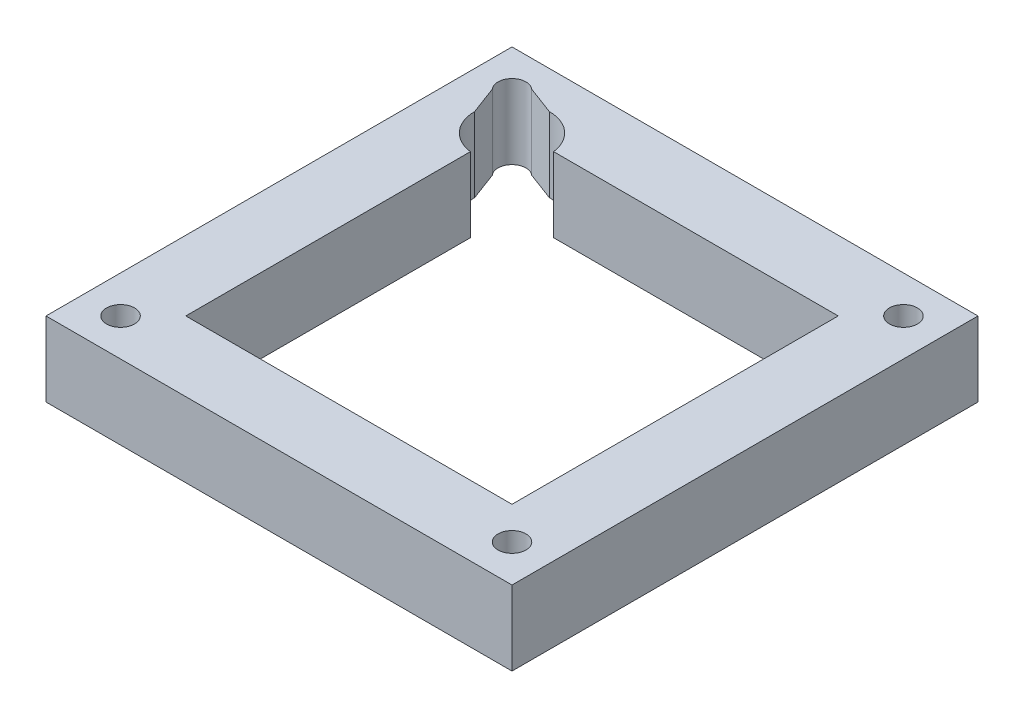
ISO-10303-21;
HEADER;
FILE_DESCRIPTION(('STEP AP214'),'2;1');
FILE_NAME('part.step','',(''),(''),'','','');
FILE_SCHEMA(('AUTOMOTIVE_DESIGN { 1 0 10303 214 1 1 1 1 }'));
ENDSEC;
DATA;
#1=APPLICATION_CONTEXT('core data for automotive mechanical design processes');
#2=APPLICATION_PROTOCOL_DEFINITION('international standard','automotive_design',2000,#1);
#3=PRODUCT_CONTEXT('',#1,'mechanical');
#4=PRODUCT('Part','Part','',(#3));
#5=PRODUCT_RELATED_PRODUCT_CATEGORY('part','',(#4));
#6=PRODUCT_DEFINITION_FORMATION('','',#4);
#7=PRODUCT_DEFINITION_CONTEXT('part definition',#1,'design');
#8=PRODUCT_DEFINITION('design','',#6,#7);
#9=PRODUCT_DEFINITION_SHAPE('','',#8);
#10=(LENGTH_UNIT() NAMED_UNIT(*) SI_UNIT(.MILLI.,.METRE.));
#11=(NAMED_UNIT(*) PLANE_ANGLE_UNIT() SI_UNIT($,.RADIAN.));
#12=(NAMED_UNIT(*) SI_UNIT($,.STERADIAN.) SOLID_ANGLE_UNIT());
#13=UNCERTAINTY_MEASURE_WITH_UNIT(LENGTH_MEASURE(1.E-05),#10,'distance_accuracy_value','');
#14=(GEOMETRIC_REPRESENTATION_CONTEXT(3) GLOBAL_UNCERTAINTY_ASSIGNED_CONTEXT((#13)) GLOBAL_UNIT_ASSIGNED_CONTEXT((#10,
#11,#12)) REPRESENTATION_CONTEXT('',''));
#15=CARTESIAN_POINT('',(0.,0.,0.));
#16=DIRECTION('',(0.,0.,1.));
#17=DIRECTION('',(1.,0.,0.));
#18=AXIS2_PLACEMENT_3D('',#15,#16,#17);
#19=CARTESIAN_POINT('',(0.,8.,25.));
#20=DIRECTION('',(0.,0.,-1.));
#21=DIRECTION('',(-1.,0.,0.));
#22=AXIS2_PLACEMENT_3D('',#19,#20,#21);
#23=PLANE('',#22);
#24=DIRECTION('',(1.,0.,0.));
#25=VECTOR('',#24,1.);
#26=CARTESIAN_POINT('',(0.,0.,25.));
#27=LINE('',#26,#25);
#28=CARTESIAN_POINT('',(-25.,0.,25.));
#29=VERTEX_POINT('',#28);
#30=CARTESIAN_POINT('',(25.,0.,25.));
#31=VERTEX_POINT('',#30);
#32=EDGE_CURVE('E383',#29,#31,#27,.T.);
#33=ORIENTED_EDGE('',*,*,#32,.T.);
#34=DIRECTION('',(0.,-1.,0.));
#35=VECTOR('',#34,1.);
#36=CARTESIAN_POINT('',(25.,8.,25.));
#37=LINE('',#36,#35);
#38=CARTESIAN_POINT('',(25.,8.,25.));
#39=VERTEX_POINT('',#38);
#40=EDGE_CURVE('E11',#39,#31,#37,.T.);
#41=ORIENTED_EDGE('',*,*,#40,.F.);
#42=DIRECTION('',(1.,0.,0.));
#43=VECTOR('',#42,1.);
#44=CARTESIAN_POINT('',(0.,8.,25.));
#45=LINE('',#44,#43);
#46=CARTESIAN_POINT('',(-25.,8.,25.));
#47=VERTEX_POINT('',#46);
#48=EDGE_CURVE('E323',#47,#39,#45,.T.);
#49=ORIENTED_EDGE('',*,*,#48,.F.);
#50=DIRECTION('',(0.,-1.,0.));
#51=VECTOR('',#50,1.);
#52=CARTESIAN_POINT('',(-25.,8.,25.));
#53=LINE('',#52,#51);
#54=EDGE_CURVE('E406',#47,#29,#53,.T.);
#55=ORIENTED_EDGE('',*,*,#54,.T.);
#56=EDGE_LOOP('',(#33,#41,#49,#55));
#57=FACE_BOUND('',#56,.T.);
#58=ADVANCED_FACE('F48',(#57),#23,.F.);
#59=CARTESIAN_POINT('',(25.,8.,0.));
#60=DIRECTION('',(-1.,0.,0.));
#61=DIRECTION('',(0.,0.,1.));
#62=AXIS2_PLACEMENT_3D('',#59,#60,#61);
#63=PLANE('',#62);
#64=DIRECTION('',(0.,0.,-1.));
#65=VECTOR('',#64,1.);
#66=CARTESIAN_POINT('',(25.,0.,0.));
#67=LINE('',#66,#65);
#68=CARTESIAN_POINT('',(25.,0.,-25.));
#69=VERTEX_POINT('',#68);
#70=EDGE_CURVE('E387',#31,#69,#67,.T.);
#71=ORIENTED_EDGE('',*,*,#70,.T.);
#72=DIRECTION('',(0.,-1.,0.));
#73=VECTOR('',#72,1.);
#74=CARTESIAN_POINT('',(25.,8.,-25.));
#75=LINE('',#74,#73);
#76=CARTESIAN_POINT('',(25.,8.,-25.));
#77=VERTEX_POINT('',#76);
#78=EDGE_CURVE('E58',#77,#69,#75,.T.);
#79=ORIENTED_EDGE('',*,*,#78,.F.);
#80=DIRECTION('',(0.,0.,-1.));
#81=VECTOR('',#80,1.);
#82=CARTESIAN_POINT('',(25.,8.,0.));
#83=LINE('',#82,#81);
#84=EDGE_CURVE('E327',#39,#77,#83,.T.);
#85=ORIENTED_EDGE('',*,*,#84,.F.);
#86=ORIENTED_EDGE('',*,*,#40,.T.);
#87=EDGE_LOOP('',(#71,#79,#85,#86));
#88=FACE_BOUND('',#87,.T.);
#89=ADVANCED_FACE('F494',(#88),#63,.F.);
#90=CARTESIAN_POINT('',(0.,8.,-25.));
#91=DIRECTION('',(0.,0.,-1.));
#92=DIRECTION('',(-1.,0.,0.));
#93=AXIS2_PLACEMENT_3D('',#90,#91,#92);
#94=PLANE('',#93);
#95=DIRECTION('',(1.,0.,0.));
#96=VECTOR('',#95,1.);
#97=CARTESIAN_POINT('',(0.,6.5000000000053,-25.));
#98=LINE('',#97,#96);
#99=CARTESIAN_POINT('',(-10.0000000000553,6.5000000000053,-25.));
#100=VERTEX_POINT('',#99);
#101=CARTESIAN_POINT('',(9.9999999999447,6.5000000000053,-25.));
#102=VERTEX_POINT('',#101);
#103=EDGE_CURVE('E74',#100,#102,#98,.T.);
#104=ORIENTED_EDGE('',*,*,#103,.F.);
#105=DIRECTION('',(0.,1.,0.));
#106=VECTOR('',#105,1.);
#107=CARTESIAN_POINT('',(-10.0000000000553,8.,-25.));
#108=LINE('',#107,#106);
#109=CARTESIAN_POINT('',(-10.0000000000553,1.5000000000053,-25.));
#110=VERTEX_POINT('',#109);
#111=EDGE_CURVE('E249',#110,#100,#108,.T.);
#112=ORIENTED_EDGE('',*,*,#111,.F.);
#113=DIRECTION('',(-1.,0.,0.));
#114=VECTOR('',#113,1.);
#115=CARTESIAN_POINT('',(0.,1.5000000000053,-25.));
#116=LINE('',#115,#114);
#117=CARTESIAN_POINT('',(9.9999999999447,1.5000000000053,-25.));
#118=VERTEX_POINT('',#117);
#119=EDGE_CURVE('E268',#118,#110,#116,.T.);
#120=ORIENTED_EDGE('',*,*,#119,.F.);
#121=DIRECTION('',(0.,-1.,0.));
#122=VECTOR('',#121,1.);
#123=CARTESIAN_POINT('',(9.9999999999447,8.,-25.));
#124=LINE('',#123,#122);
#125=EDGE_CURVE('E264',#102,#118,#124,.T.);
#126=ORIENTED_EDGE('',*,*,#125,.F.);
#127=EDGE_LOOP('',(#104,#112,#120,#126));
#128=FACE_BOUND('',#127,.T.);
#129=DIRECTION('',(1.,0.,0.));
#130=VECTOR('',#129,1.);
#131=CARTESIAN_POINT('',(0.,0.,-25.));
#132=LINE('',#131,#130);
#133=CARTESIAN_POINT('',(-25.,0.,-25.));
#134=VERTEX_POINT('',#133);
#135=EDGE_CURVE('E391',#134,#69,#132,.T.);
#136=ORIENTED_EDGE('',*,*,#135,.F.);
#137=DIRECTION('',(0.,-1.,0.));
#138=VECTOR('',#137,1.);
#139=CARTESIAN_POINT('',(-25.,8.,-25.));
#140=LINE('',#139,#138);
#141=CARTESIAN_POINT('',(-25.,8.,-25.));
#142=VERTEX_POINT('',#141);
#143=EDGE_CURVE('E409',#142,#134,#140,.T.);
#144=ORIENTED_EDGE('',*,*,#143,.F.);
#145=DIRECTION('',(1.,0.,0.));
#146=VECTOR('',#145,1.);
#147=CARTESIAN_POINT('',(0.,8.,-25.));
#148=LINE('',#147,#146);
#149=EDGE_CURVE('E330',#142,#77,#148,.T.);
#150=ORIENTED_EDGE('',*,*,#149,.T.);
#151=ORIENTED_EDGE('',*,*,#78,.T.);
#152=EDGE_LOOP('',(#136,#144,#150,#151));
#153=FACE_BOUND('',#152,.T.);
#154=ADVANCED_FACE('F492',(#128,#153),#94,.T.);
#155=CARTESIAN_POINT('',(-17.,8.,-17.));
#156=DIRECTION('',(0.,-1.,0.));
#157=DIRECTION('',(0.,0.,-1.));
#158=AXIS2_PLACEMENT_3D('',#155,#156,#157);
#159=CYLINDRICAL_SURFACE('',#158,4.);
#160=CARTESIAN_POINT('',(-17.,0.,-17.));
#161=DIRECTION('',(0.,1.,0.));
#162=DIRECTION('',(0.,0.,1.));
#163=AXIS2_PLACEMENT_3D('',#160,#161,#162);
#164=CIRCLE('',#163,4.);
#165=CARTESIAN_POINT('',(-13.0313730334031,0.,-17.5));
#166=VERTEX_POINT('',#165);
#167=CARTESIAN_POINT('',(-17.,0.,-21.));
#168=VERTEX_POINT('',#167);
#169=EDGE_CURVE('E278',#166,#168,#164,.T.);
#170=ORIENTED_EDGE('',*,*,#169,.F.);
#171=DIRECTION('',(0.,-1.,0.));
#172=VECTOR('',#171,1.);
#173=CARTESIAN_POINT('',(-13.0313730334031,8.,-17.5));
#174=LINE('',#173,#172);
#175=CARTESIAN_POINT('',(-13.0313730334031,8.,-17.5));
#176=VERTEX_POINT('',#175);
#177=EDGE_CURVE('E52',#176,#166,#174,.T.);
#178=ORIENTED_EDGE('',*,*,#177,.F.);
#179=CARTESIAN_POINT('',(-17.,8.,-17.));
#180=DIRECTION('',(0.,1.,0.));
#181=DIRECTION('',(0.,0.,1.));
#182=AXIS2_PLACEMENT_3D('',#179,#180,#181);
#183=CIRCLE('',#182,4.);
#184=CARTESIAN_POINT('',(-17.,8.,-21.));
#185=VERTEX_POINT('',#184);
#186=EDGE_CURVE('E287',#176,#185,#183,.T.);
#187=ORIENTED_EDGE('',*,*,#186,.T.);
#188=DIRECTION('',(0.,-1.,0.));
#189=VECTOR('',#188,1.);
#190=CARTESIAN_POINT('',(-17.,8.,-21.));
#191=LINE('',#190,#189);
#192=EDGE_CURVE('E346',#185,#168,#191,.T.);
#193=ORIENTED_EDGE('',*,*,#192,.T.);
#194=EDGE_LOOP('',(#170,#178,#187,#193));
#195=FACE_BOUND('',#194,.T.);
#196=ADVANCED_FACE('F444',(#195),#159,.F.);
#197=CARTESIAN_POINT('',(0.,8.,-17.5));
#198=DIRECTION('',(0.,0.,1.));
#199=DIRECTION('',(1.,0.,0.));
#200=AXIS2_PLACEMENT_3D('',#197,#198,#199);
#201=PLANE('',#200);
#202=DIRECTION('',(-1.,0.,0.));
#203=VECTOR('',#202,1.);
#204=CARTESIAN_POINT('',(0.,0.,-17.5));
#205=LINE('',#204,#203);
#206=CARTESIAN_POINT('',(17.5,0.,-17.5));
#207=VERTEX_POINT('',#206);
#208=EDGE_CURVE('E350',#207,#166,#205,.T.);
#209=ORIENTED_EDGE('',*,*,#208,.F.);
#210=DIRECTION('',(0.,-1.,0.));
#211=VECTOR('',#210,1.);
#212=CARTESIAN_POINT('',(17.5,8.,-17.5));
#213=LINE('',#212,#211);
#214=CARTESIAN_POINT('',(17.5,8.,-17.5));
#215=VERTEX_POINT('',#214);
#216=EDGE_CURVE('E433',#215,#207,#213,.T.);
#217=ORIENTED_EDGE('',*,*,#216,.F.);
#218=DIRECTION('',(-1.,0.,0.));
#219=VECTOR('',#218,1.);
#220=CARTESIAN_POINT('',(0.,8.,-17.5));
#221=LINE('',#220,#219);
#222=EDGE_CURVE('E291',#215,#176,#221,.T.);
#223=ORIENTED_EDGE('',*,*,#222,.T.);
#224=ORIENTED_EDGE('',*,*,#177,.T.);
#225=EDGE_LOOP('',(#209,#217,#223,#224));
#226=FACE_BOUND('',#225,.T.);
#227=ADVANCED_FACE('F50',(#226),#201,.T.);
#228=CARTESIAN_POINT('',(17.5,8.,0.));
#229=DIRECTION('',(-1.,0.,0.));
#230=DIRECTION('',(0.,0.,1.));
#231=AXIS2_PLACEMENT_3D('',#228,#229,#230);
#232=PLANE('',#231);
#233=DIRECTION('',(0.,0.,-1.));
#234=VECTOR('',#233,1.);
#235=CARTESIAN_POINT('',(17.5,0.,0.));
#236=LINE('',#235,#234);
#237=CARTESIAN_POINT('',(17.5,0.,17.5));
#238=VERTEX_POINT('',#237);
#239=EDGE_CURVE('E355',#238,#207,#236,.T.);
#240=ORIENTED_EDGE('',*,*,#239,.F.);
#241=DIRECTION('',(0.,-1.,0.));
#242=VECTOR('',#241,1.);
#243=CARTESIAN_POINT('',(17.5,8.,17.5));
#244=LINE('',#243,#242);
#245=CARTESIAN_POINT('',(17.5,8.,17.5));
#246=VERTEX_POINT('',#245);
#247=EDGE_CURVE('E431',#246,#238,#244,.T.);
#248=ORIENTED_EDGE('',*,*,#247,.F.);
#249=DIRECTION('',(0.,0.,-1.));
#250=VECTOR('',#249,1.);
#251=CARTESIAN_POINT('',(17.5,8.,0.));
#252=LINE('',#251,#250);
#253=EDGE_CURVE('E297',#246,#215,#252,.T.);
#254=ORIENTED_EDGE('',*,*,#253,.T.);
#255=ORIENTED_EDGE('',*,*,#216,.T.);
#256=EDGE_LOOP('',(#240,#248,#254,#255));
#257=FACE_BOUND('',#256,.T.);
#258=ADVANCED_FACE('F452',(#257),#232,.T.);
#259=CARTESIAN_POINT('',(0.,8.,17.5));
#260=DIRECTION('',(0.,0.,-1.));
#261=DIRECTION('',(-1.,0.,0.));
#262=AXIS2_PLACEMENT_3D('',#259,#260,#261);
#263=PLANE('',#262);
#264=DIRECTION('',(1.,0.,0.));
#265=VECTOR('',#264,1.);
#266=CARTESIAN_POINT('',(0.,0.,17.5));
#267=LINE('',#266,#265);
#268=CARTESIAN_POINT('',(-17.5,0.,17.5));
#269=VERTEX_POINT('',#268);
#270=EDGE_CURVE('E359',#269,#238,#267,.T.);
#271=ORIENTED_EDGE('',*,*,#270,.F.);
#272=DIRECTION('',(0.,-1.,0.));
#273=VECTOR('',#272,1.);
#274=CARTESIAN_POINT('',(-17.5,8.,17.5));
#275=LINE('',#274,#273);
#276=CARTESIAN_POINT('',(-17.5,8.,17.5));
#277=VERTEX_POINT('',#276);
#278=EDGE_CURVE('E428',#277,#269,#275,.T.);
#279=ORIENTED_EDGE('',*,*,#278,.F.);
#280=DIRECTION('',(1.,0.,0.));
#281=VECTOR('',#280,1.);
#282=CARTESIAN_POINT('',(0.,8.,17.5));
#283=LINE('',#282,#281);
#284=EDGE_CURVE('E301',#277,#246,#283,.T.);
#285=ORIENTED_EDGE('',*,*,#284,.T.);
#286=ORIENTED_EDGE('',*,*,#247,.T.);
#287=EDGE_LOOP('',(#271,#279,#285,#286));
#288=FACE_BOUND('',#287,.T.);
#289=ADVANCED_FACE('F459',(#288),#263,.T.);
#290=CARTESIAN_POINT('',(-17.5,8.,0.));
#291=DIRECTION('',(-1.,0.,0.));
#292=DIRECTION('',(0.,0.,1.));
#293=AXIS2_PLACEMENT_3D('',#290,#291,#292);
#294=PLANE('',#293);
#295=DIRECTION('',(0.,0.,-1.));
#296=VECTOR('',#295,1.);
#297=CARTESIAN_POINT('',(-17.5,0.,0.));
#298=LINE('',#297,#296);
#299=CARTESIAN_POINT('',(-17.5,0.,-13.0313730334031));
#300=VERTEX_POINT('',#299);
#301=EDGE_CURVE('E363',#269,#300,#298,.T.);
#302=ORIENTED_EDGE('',*,*,#301,.T.);
#303=DIRECTION('',(0.,-1.,0.));
#304=VECTOR('',#303,1.);
#305=CARTESIAN_POINT('',(-17.5,8.,-13.0313730334031));
#306=LINE('',#305,#304);
#307=CARTESIAN_POINT('',(-17.5,8.,-13.0313730334031));
#308=VERTEX_POINT('',#307);
#309=EDGE_CURVE('E425',#308,#300,#306,.T.);
#310=ORIENTED_EDGE('',*,*,#309,.F.);
#311=DIRECTION('',(0.,0.,-1.));
#312=VECTOR('',#311,1.);
#313=CARTESIAN_POINT('',(-17.5,8.,0.));
#314=LINE('',#313,#312);
#315=EDGE_CURVE('E305',#277,#308,#314,.T.);
#316=ORIENTED_EDGE('',*,*,#315,.F.);
#317=ORIENTED_EDGE('',*,*,#278,.T.);
#318=EDGE_LOOP('',(#302,#310,#316,#317));
#319=FACE_BOUND('',#318,.T.);
#320=ADVANCED_FACE('F463',(#319),#294,.F.);
#321=CARTESIAN_POINT('',(-21.,0.,-17.));
#322=VERTEX_POINT('',#321);
#323=EDGE_CURVE('E351',#322,#300,#164,.T.);
#324=ORIENTED_EDGE('',*,*,#323,.F.);
#325=DIRECTION('',(0.,-1.,0.));
#326=VECTOR('',#325,1.);
#327=CARTESIAN_POINT('',(-21.,8.,-17.));
#328=LINE('',#327,#326);
#329=CARTESIAN_POINT('',(-21.,8.,-17.));
#330=VERTEX_POINT('',#329);
#331=EDGE_CURVE('E422',#330,#322,#328,.T.);
#332=ORIENTED_EDGE('',*,*,#331,.F.);
#333=EDGE_CURVE('E293',#330,#308,#183,.T.);
#334=ORIENTED_EDGE('',*,*,#333,.T.);
#335=ORIENTED_EDGE('',*,*,#309,.T.);
#336=EDGE_LOOP('',(#324,#332,#334,#335));
#337=FACE_BOUND('',#336,.T.);
#338=ADVANCED_FACE('F482',(#337),#159,.F.);
#339=CARTESIAN_POINT('',(-12.8219178082192,8.,4.80821917808219));
#340=DIRECTION('',(0.936329177569045,0.,-0.351123441588392));
#341=DIRECTION('',(-0.351123441588392,0.,-0.936329177569045));
#342=AXIS2_PLACEMENT_3D('',#339,#340,#341);
#343=PLANE('',#342);
#344=DIRECTION('',(0.351123441588392,0.,0.936329177569044));
#345=VECTOR('',#344,1.);
#346=CARTESIAN_POINT('',(-12.8219178082192,0.,4.80821917808219));
#347=LINE('',#346,#345);
#348=CARTESIAN_POINT('',(-22.1301369863014,0.,-20.013698630137));
#349=VERTEX_POINT('',#348);
#350=EDGE_CURVE('E367',#349,#322,#347,.T.);
#351=ORIENTED_EDGE('',*,*,#350,.F.);
#352=DIRECTION('',(0.,-1.,0.));
#353=VECTOR('',#352,1.);
#354=CARTESIAN_POINT('',(-22.1301369863014,8.,-20.013698630137));
#355=LINE('',#354,#353);
#356=CARTESIAN_POINT('',(-22.1301369863014,8.,-20.013698630137));
#357=VERTEX_POINT('',#356);
#358=EDGE_CURVE('E419',#357,#349,#355,.T.);
#359=ORIENTED_EDGE('',*,*,#358,.F.);
#360=DIRECTION('',(0.351123441588392,0.,0.936329177569044));
#361=VECTOR('',#360,1.);
#362=CARTESIAN_POINT('',(-12.8219178082192,8.,4.80821917808219));
#363=LINE('',#362,#361);
#364=EDGE_CURVE('E308',#357,#330,#363,.T.);
#365=ORIENTED_EDGE('',*,*,#364,.T.);
#366=ORIENTED_EDGE('',*,*,#331,.T.);
#367=EDGE_LOOP('',(#351,#359,#365,#366));
#368=FACE_BOUND('',#367,.T.);
#369=ADVANCED_FACE('F472',(#368),#343,.T.);
#370=CARTESIAN_POINT('',(-21.,8.,-21.));
#371=DIRECTION('',(0.,-1.,0.));
#372=DIRECTION('',(0.,0.,-1.));
#373=AXIS2_PLACEMENT_3D('',#370,#371,#372);
#374=CYLINDRICAL_SURFACE('',#373,1.5);
#375=CARTESIAN_POINT('',(-21.,0.,-21.));
#376=DIRECTION('',(0.,1.,0.));
#377=DIRECTION('',(0.,0.,1.));
#378=AXIS2_PLACEMENT_3D('',#375,#376,#377);
#379=CIRCLE('',#378,1.5);
#380=CARTESIAN_POINT('',(-20.013698630137,0.,-22.1301369863014));
#381=VERTEX_POINT('',#380);
#382=EDGE_CURVE('E371',#381,#349,#379,.T.);
#383=ORIENTED_EDGE('',*,*,#382,.F.);
#384=DIRECTION('',(0.,-1.,0.));
#385=VECTOR('',#384,1.);
#386=CARTESIAN_POINT('',(-20.013698630137,8.,-22.1301369863014));
#387=LINE('',#386,#385);
#388=CARTESIAN_POINT('',(-20.013698630137,8.,-22.1301369863014));
#389=VERTEX_POINT('',#388);
#390=EDGE_CURVE('E416',#389,#381,#387,.T.);
#391=ORIENTED_EDGE('',*,*,#390,.F.);
#392=CARTESIAN_POINT('',(-21.,8.,-21.));
#393=DIRECTION('',(0.,1.,0.));
#394=DIRECTION('',(0.,0.,1.));
#395=AXIS2_PLACEMENT_3D('',#392,#393,#394);
#396=CIRCLE('',#395,1.5);
#397=EDGE_CURVE('E312',#389,#357,#396,.T.);
#398=ORIENTED_EDGE('',*,*,#397,.T.);
#399=ORIENTED_EDGE('',*,*,#358,.T.);
#400=EDGE_LOOP('',(#383,#391,#398,#399));
#401=FACE_BOUND('',#400,.T.);
#402=ADVANCED_FACE('F476',(#401),#374,.F.);
#403=CARTESIAN_POINT('',(21.,8.,21.));
#404=DIRECTION('',(0.,-1.,0.));
#405=DIRECTION('',(0.,0.,-1.));
#406=AXIS2_PLACEMENT_3D('',#403,#404,#405);
#407=CYLINDRICAL_SURFACE('',#406,1.5);
#408=CARTESIAN_POINT('',(21.,8.,21.));
#409=DIRECTION('',(0.,1.,0.));
#410=DIRECTION('',(0.,0.,1.));
#411=AXIS2_PLACEMENT_3D('',#408,#409,#410);
#412=CIRCLE('',#411,1.5);
#413=CARTESIAN_POINT('',(21.,8.,22.5));
#414=VERTEX_POINT('',#413);
#415=EDGE_CURVE('E338',#414,#414,#412,.T.);
#416=ORIENTED_EDGE('',*,*,#415,.T.);
#417=EDGE_LOOP('',(#416));
#418=FACE_BOUND('',#417,.T.);
#419=CARTESIAN_POINT('',(21.,0.,21.));
#420=DIRECTION('',(0.,1.,0.));
#421=DIRECTION('',(0.,0.,1.));
#422=AXIS2_PLACEMENT_3D('',#419,#420,#421);
#423=CIRCLE('',#422,1.5);
#424=CARTESIAN_POINT('',(21.,0.,22.5));
#425=VERTEX_POINT('',#424);
#426=EDGE_CURVE('E399',#425,#425,#423,.T.);
#427=ORIENTED_EDGE('',*,*,#426,.F.);
#428=EDGE_LOOP('',(#427));
#429=FACE_BOUND('',#428,.T.);
#430=ADVANCED_FACE('F513',(#418,#429),#407,.F.);
#431=CARTESIAN_POINT('',(-25.,8.,0.));
#432=DIRECTION('',(-1.,0.,0.));
#433=DIRECTION('',(0.,0.,1.));
#434=AXIS2_PLACEMENT_3D('',#431,#432,#433);
#435=PLANE('',#434);
#436=DIRECTION('',(0.,0.,-1.));
#437=VECTOR('',#436,1.);
#438=CARTESIAN_POINT('',(-25.,6.5,0.));
#439=LINE('',#438,#437);
#440=CARTESIAN_POINT('',(-25.,6.5,10.));
#441=VERTEX_POINT('',#440);
#442=CARTESIAN_POINT('',(-25.,6.5,-10.));
#443=VERTEX_POINT('',#442);
#444=EDGE_CURVE('E66',#441,#443,#439,.T.);
#445=ORIENTED_EDGE('',*,*,#444,.F.);
#446=DIRECTION('',(0.,1.,0.));
#447=VECTOR('',#446,1.);
#448=CARTESIAN_POINT('',(-25.,8.,10.));
#449=LINE('',#448,#447);
#450=CARTESIAN_POINT('',(-25.,1.5,10.));
#451=VERTEX_POINT('',#450);
#452=EDGE_CURVE('E217',#451,#441,#449,.T.);
#453=ORIENTED_EDGE('',*,*,#452,.F.);
#454=DIRECTION('',(0.,0.,1.));
#455=VECTOR('',#454,1.);
#456=CARTESIAN_POINT('',(-25.,1.50000000000004,0.));
#457=LINE('',#456,#455);
#458=CARTESIAN_POINT('',(-25.,1.50000000000007,-10.));
#459=VERTEX_POINT('',#458);
#460=EDGE_CURVE('E221',#459,#451,#457,.T.);
#461=ORIENTED_EDGE('',*,*,#460,.F.);
#462=DIRECTION('',(0.,-1.,0.));
#463=VECTOR('',#462,1.);
#464=CARTESIAN_POINT('',(-25.,8.,-10.));
#465=LINE('',#464,#463);
#466=EDGE_CURVE('E230',#443,#459,#465,.T.);
#467=ORIENTED_EDGE('',*,*,#466,.F.);
#468=EDGE_LOOP('',(#445,#453,#461,#467));
#469=FACE_BOUND('',#468,.T.);
#470=DIRECTION('',(0.,0.,-1.));
#471=VECTOR('',#470,1.);
#472=CARTESIAN_POINT('',(-25.,0.,0.));
#473=LINE('',#472,#471);
#474=EDGE_CURVE('E395',#29,#134,#473,.T.);
#475=ORIENTED_EDGE('',*,*,#474,.F.);
#476=ORIENTED_EDGE('',*,*,#54,.F.);
#477=DIRECTION('',(0.,0.,-1.));
#478=VECTOR('',#477,1.);
#479=CARTESIAN_POINT('',(-25.,8.,0.));
#480=LINE('',#479,#478);
#481=EDGE_CURVE('E334',#47,#142,#480,.T.);
#482=ORIENTED_EDGE('',*,*,#481,.T.);
#483=ORIENTED_EDGE('',*,*,#143,.T.);
#484=EDGE_LOOP('',(#475,#476,#482,#483));
#485=FACE_BOUND('',#484,.T.);
#486=ADVANCED_FACE('F507',(#469,#485),#435,.T.);
#487=CARTESIAN_POINT('',(21.,8.,-21.));
#488=DIRECTION('',(0.,-1.,0.));
#489=DIRECTION('',(0.,0.,-1.));
#490=AXIS2_PLACEMENT_3D('',#487,#488,#489);
#491=CYLINDRICAL_SURFACE('',#490,1.5);
#492=CARTESIAN_POINT('',(21.,8.,-21.));
#493=DIRECTION('',(0.,1.,0.));
#494=DIRECTION('',(0.,0.,1.));
#495=AXIS2_PLACEMENT_3D('',#492,#493,#494);
#496=CIRCLE('',#495,1.5);
#497=CARTESIAN_POINT('',(21.,8.,-19.5));
#498=VERTEX_POINT('',#497);
#499=EDGE_CURVE('E319',#498,#498,#496,.F.);
#500=ORIENTED_EDGE('',*,*,#499,.F.);
#501=EDGE_LOOP('',(#500));
#502=FACE_BOUND('',#501,.T.);
#503=CARTESIAN_POINT('',(21.,0.,-21.));
#504=DIRECTION('',(0.,1.,0.));
#505=DIRECTION('',(0.,0.,1.));
#506=AXIS2_PLACEMENT_3D('',#503,#504,#505);
#507=CIRCLE('',#506,1.5);
#508=CARTESIAN_POINT('',(21.,0.,-19.5));
#509=VERTEX_POINT('',#508);
#510=EDGE_CURVE('E379',#509,#509,#507,.F.);
#511=ORIENTED_EDGE('',*,*,#510,.T.);
#512=EDGE_LOOP('',(#511));
#513=FACE_BOUND('',#512,.T.);
#514=ADVANCED_FACE('F504',(#502,#513),#491,.F.);
#515=CARTESIAN_POINT('',(4.80821917808219,8.,-12.8219178082192));
#516=DIRECTION('',(0.351123441588392,0.,-0.936329177569045));
#517=DIRECTION('',(-0.936329177569045,0.,-0.351123441588392));
#518=AXIS2_PLACEMENT_3D('',#515,#516,#517);
#519=PLANE('',#518);
#520=DIRECTION('',(0.936329177569044,0.,0.351123441588392));
#521=VECTOR('',#520,1.);
#522=CARTESIAN_POINT('',(4.80821917808219,0.,-12.8219178082192));
#523=LINE('',#522,#521);
#524=EDGE_CURVE('E375',#381,#168,#523,.T.);
#525=ORIENTED_EDGE('',*,*,#524,.T.);
#526=ORIENTED_EDGE('',*,*,#192,.F.);
#527=DIRECTION('',(0.936329177569044,0.,0.351123441588392));
#528=VECTOR('',#527,1.);
#529=CARTESIAN_POINT('',(4.80821917808219,8.,-12.8219178082192));
#530=LINE('',#529,#528);
#531=EDGE_CURVE('E316',#389,#185,#530,.T.);
#532=ORIENTED_EDGE('',*,*,#531,.F.);
#533=ORIENTED_EDGE('',*,*,#390,.T.);
#534=EDGE_LOOP('',(#525,#526,#532,#533));
#535=FACE_BOUND('',#534,.T.);
#536=ADVANCED_FACE('F479',(#535),#519,.F.);
#537=CARTESIAN_POINT('',(-21.,8.,21.));
#538=DIRECTION('',(0.,-1.,0.));
#539=DIRECTION('',(0.,0.,-1.));
#540=AXIS2_PLACEMENT_3D('',#537,#538,#539);
#541=CYLINDRICAL_SURFACE('',#540,1.5);
#542=CARTESIAN_POINT('',(-21.,8.,21.));
#543=DIRECTION('',(0.,1.,0.));
#544=DIRECTION('',(0.,0.,1.));
#545=AXIS2_PLACEMENT_3D('',#542,#543,#544);
#546=CIRCLE('',#545,1.5);
#547=CARTESIAN_POINT('',(-21.,8.,22.5));
#548=VERTEX_POINT('',#547);
#549=EDGE_CURVE('E342',#548,#548,#546,.F.);
#550=ORIENTED_EDGE('',*,*,#549,.F.);
#551=EDGE_LOOP('',(#550));
#552=FACE_BOUND('',#551,.T.);
#553=CARTESIAN_POINT('',(-21.,0.,21.));
#554=DIRECTION('',(0.,1.,0.));
#555=DIRECTION('',(0.,0.,1.));
#556=AXIS2_PLACEMENT_3D('',#553,#554,#555);
#557=CIRCLE('',#556,1.5);
#558=CARTESIAN_POINT('',(-21.,0.,22.5));
#559=VERTEX_POINT('',#558);
#560=EDGE_CURVE('E292',#559,#559,#557,.F.);
#561=ORIENTED_EDGE('',*,*,#560,.T.);
#562=EDGE_LOOP('',(#561));
#563=FACE_BOUND('',#562,.T.);
#564=ADVANCED_FACE('F511',(#552,#563),#541,.F.);
#565=CARTESIAN_POINT('',(0.,8.,0.));
#566=DIRECTION('',(0.,1.,0.));
#567=DIRECTION('',(0.,0.,1.));
#568=AXIS2_PLACEMENT_3D('',#565,#566,#567);
#569=PLANE('',#568);
#570=ORIENTED_EDGE('',*,*,#186,.F.);
#571=ORIENTED_EDGE('',*,*,#222,.F.);
#572=ORIENTED_EDGE('',*,*,#253,.F.);
#573=ORIENTED_EDGE('',*,*,#284,.F.);
#574=ORIENTED_EDGE('',*,*,#315,.T.);
#575=ORIENTED_EDGE('',*,*,#333,.F.);
#576=ORIENTED_EDGE('',*,*,#364,.F.);
#577=ORIENTED_EDGE('',*,*,#397,.F.);
#578=ORIENTED_EDGE('',*,*,#531,.T.);
#579=EDGE_LOOP('',(#570,#571,#572,#573,#574,#575,#576,#577,#578));
#580=FACE_BOUND('',#579,.T.);
#581=ORIENTED_EDGE('',*,*,#499,.T.);
#582=EDGE_LOOP('',(#581));
#583=FACE_BOUND('',#582,.T.);
#584=ORIENTED_EDGE('',*,*,#48,.T.);
#585=ORIENTED_EDGE('',*,*,#84,.T.);
#586=ORIENTED_EDGE('',*,*,#149,.F.);
#587=ORIENTED_EDGE('',*,*,#481,.F.);
#588=EDGE_LOOP('',(#584,#585,#586,#587));
#589=FACE_BOUND('',#588,.T.);
#590=ORIENTED_EDGE('',*,*,#415,.F.);
#591=EDGE_LOOP('',(#590));
#592=FACE_BOUND('',#591,.T.);
#593=ORIENTED_EDGE('',*,*,#549,.T.);
#594=EDGE_LOOP('',(#593));
#595=FACE_BOUND('',#594,.T.);
#596=ADVANCED_FACE('F457',(#580,#583,#589,#592,#595),#569,.T.);
#597=CARTESIAN_POINT('',(0.,0.,0.));
#598=DIRECTION('',(0.,1.,0.));
#599=DIRECTION('',(0.,0.,1.));
#600=AXIS2_PLACEMENT_3D('',#597,#598,#599);
#601=PLANE('',#600);
#602=ORIENTED_EDGE('',*,*,#169,.T.);
#603=ORIENTED_EDGE('',*,*,#524,.F.);
#604=ORIENTED_EDGE('',*,*,#382,.T.);
#605=ORIENTED_EDGE('',*,*,#350,.T.);
#606=ORIENTED_EDGE('',*,*,#323,.T.);
#607=ORIENTED_EDGE('',*,*,#301,.F.);
#608=ORIENTED_EDGE('',*,*,#270,.T.);
#609=ORIENTED_EDGE('',*,*,#239,.T.);
#610=ORIENTED_EDGE('',*,*,#208,.T.);
#611=EDGE_LOOP('',(#602,#603,#604,#605,#606,#607,#608,#609,#610));
#612=FACE_BOUND('',#611,.T.);
#613=ORIENTED_EDGE('',*,*,#510,.F.);
#614=EDGE_LOOP('',(#613));
#615=FACE_BOUND('',#614,.T.);
#616=ORIENTED_EDGE('',*,*,#32,.F.);
#617=ORIENTED_EDGE('',*,*,#474,.T.);
#618=ORIENTED_EDGE('',*,*,#135,.T.);
#619=ORIENTED_EDGE('',*,*,#70,.F.);
#620=EDGE_LOOP('',(#616,#617,#618,#619));
#621=FACE_BOUND('',#620,.T.);
#622=ORIENTED_EDGE('',*,*,#426,.T.);
#623=EDGE_LOOP('',(#622));
#624=FACE_BOUND('',#623,.T.);
#625=ORIENTED_EDGE('',*,*,#560,.F.);
#626=EDGE_LOOP('',(#625));
#627=FACE_BOUND('',#626,.T.);
#628=ADVANCED_FACE('F448',(#612,#615,#621,#624,#627),#601,.F.);
#629=CARTESIAN_POINT('',(0.,6.5000000000053,-21.));
#630=DIRECTION('',(0.,1.,0.));
#631=DIRECTION('',(0.,0.,1.));
#632=AXIS2_PLACEMENT_3D('',#629,#630,#631);
#633=PLANE('',#632);
#634=ORIENTED_EDGE('',*,*,#103,.T.);
#635=DIRECTION('',(0.,0.,-1.));
#636=VECTOR('',#635,1.);
#637=CARTESIAN_POINT('',(9.9999999999447,6.5000000000053,-21.));
#638=LINE('',#637,#636);
#639=CARTESIAN_POINT('',(9.9999999999447,6.5000000000053,-21.));
#640=VERTEX_POINT('',#639);
#641=EDGE_CURVE('E261',#640,#102,#638,.T.);
#642=ORIENTED_EDGE('',*,*,#641,.F.);
#643=DIRECTION('',(1.,0.,0.));
#644=VECTOR('',#643,1.);
#645=CARTESIAN_POINT('',(0.,6.5000000000053,-21.));
#646=LINE('',#645,#644);
#647=CARTESIAN_POINT('',(-10.0000000000553,6.5000000000053,-21.));
#648=VERTEX_POINT('',#647);
#649=EDGE_CURVE('E244',#648,#640,#646,.T.);
#650=ORIENTED_EDGE('',*,*,#649,.F.);
#651=DIRECTION('',(0.,0.,-1.));
#652=VECTOR('',#651,1.);
#653=CARTESIAN_POINT('',(-10.0000000000553,6.5000000000053,-21.));
#654=LINE('',#653,#652);
#655=EDGE_CURVE('E275',#648,#100,#654,.T.);
#656=ORIENTED_EDGE('',*,*,#655,.T.);
#657=EDGE_LOOP('',(#634,#642,#650,#656));
#658=FACE_BOUND('',#657,.T.);
#659=ADVANCED_FACE('F561',(#658),#633,.F.);
#660=CARTESIAN_POINT('',(-10.0000000000553,8.,-21.));
#661=DIRECTION('',(-1.,0.,0.));
#662=DIRECTION('',(0.,0.,1.));
#663=AXIS2_PLACEMENT_3D('',#660,#661,#662);
#664=PLANE('',#663);
#665=ORIENTED_EDGE('',*,*,#111,.T.);
#666=ORIENTED_EDGE('',*,*,#655,.F.);
#667=DIRECTION('',(0.,1.,0.));
#668=VECTOR('',#667,1.);
#669=CARTESIAN_POINT('',(-10.0000000000553,8.,-21.));
#670=LINE('',#669,#668);
#671=CARTESIAN_POINT('',(-10.0000000000553,1.5000000000053,-21.));
#672=VERTEX_POINT('',#671);
#673=EDGE_CURVE('E257',#672,#648,#670,.T.);
#674=ORIENTED_EDGE('',*,*,#673,.F.);
#675=DIRECTION('',(0.,0.,-1.));
#676=VECTOR('',#675,1.);
#677=CARTESIAN_POINT('',(-10.0000000000553,1.5000000000053,-21.));
#678=LINE('',#677,#676);
#679=EDGE_CURVE('E279',#672,#110,#678,.T.);
#680=ORIENTED_EDGE('',*,*,#679,.T.);
#681=EDGE_LOOP('',(#665,#666,#674,#680));
#682=FACE_BOUND('',#681,.T.);
#683=ADVANCED_FACE('F565',(#682),#664,.F.);
#684=CARTESIAN_POINT('',(0.,1.5000000000053,-21.));
#685=DIRECTION('',(0.,-1.,0.));
#686=DIRECTION('',(0.,0.,-1.));
#687=AXIS2_PLACEMENT_3D('',#684,#685,#686);
#688=PLANE('',#687);
#689=ORIENTED_EDGE('',*,*,#119,.T.);
#690=ORIENTED_EDGE('',*,*,#679,.F.);
#691=DIRECTION('',(-1.,0.,0.));
#692=VECTOR('',#691,1.);
#693=CARTESIAN_POINT('',(0.,1.5000000000053,-21.));
#694=LINE('',#693,#692);
#695=CARTESIAN_POINT('',(9.9999999999447,1.5000000000053,-21.));
#696=VERTEX_POINT('',#695);
#697=EDGE_CURVE('E253',#696,#672,#694,.T.);
#698=ORIENTED_EDGE('',*,*,#697,.F.);
#699=DIRECTION('',(0.,0.,-1.));
#700=VECTOR('',#699,1.);
#701=CARTESIAN_POINT('',(9.9999999999447,1.5000000000053,-21.));
#702=LINE('',#701,#700);
#703=EDGE_CURVE('E282',#696,#118,#702,.T.);
#704=ORIENTED_EDGE('',*,*,#703,.T.);
#705=EDGE_LOOP('',(#689,#690,#698,#704));
#706=FACE_BOUND('',#705,.T.);
#707=ADVANCED_FACE('F572',(#706),#688,.F.);
#708=CARTESIAN_POINT('',(9.9999999999447,8.,-21.));
#709=DIRECTION('',(1.,0.,0.));
#710=DIRECTION('',(0.,0.,-1.));
#711=AXIS2_PLACEMENT_3D('',#708,#709,#710);
#712=PLANE('',#711);
#713=ORIENTED_EDGE('',*,*,#125,.T.);
#714=ORIENTED_EDGE('',*,*,#703,.F.);
#715=DIRECTION('',(0.,-1.,0.));
#716=VECTOR('',#715,1.);
#717=CARTESIAN_POINT('',(9.9999999999447,8.,-21.));
#718=LINE('',#717,#716);
#719=EDGE_CURVE('E248',#640,#696,#718,.T.);
#720=ORIENTED_EDGE('',*,*,#719,.F.);
#721=ORIENTED_EDGE('',*,*,#641,.T.);
#722=EDGE_LOOP('',(#713,#714,#720,#721));
#723=FACE_BOUND('',#722,.T.);
#724=ADVANCED_FACE('F568',(#723),#712,.F.);
#725=CARTESIAN_POINT('',(0.,0.,-21.));
#726=DIRECTION('',(0.,0.,-1.));
#727=DIRECTION('',(-1.,0.,0.));
#728=AXIS2_PLACEMENT_3D('',#725,#726,#727);
#729=PLANE('',#728);
#730=ORIENTED_EDGE('',*,*,#649,.T.);
#731=ORIENTED_EDGE('',*,*,#719,.T.);
#732=ORIENTED_EDGE('',*,*,#697,.T.);
#733=ORIENTED_EDGE('',*,*,#673,.T.);
#734=EDGE_LOOP('',(#730,#731,#732,#733));
#735=FACE_BOUND('',#734,.T.);
#736=ADVANCED_FACE('F571',(#735),#729,.T.);
#737=CARTESIAN_POINT('',(-21.,6.5,0.));
#738=DIRECTION('',(0.,1.,0.));
#739=DIRECTION('',(0.,0.,1.));
#740=AXIS2_PLACEMENT_3D('',#737,#738,#739);
#741=PLANE('',#740);
#742=ORIENTED_EDGE('',*,*,#444,.T.);
#743=DIRECTION('',(-1.,0.,0.));
#744=VECTOR('',#743,1.);
#745=CARTESIAN_POINT('',(-21.,6.5,-10.));
#746=LINE('',#745,#744);
#747=CARTESIAN_POINT('',(-21.,6.5,-10.));
#748=VERTEX_POINT('',#747);
#749=EDGE_CURVE('E192',#748,#443,#746,.T.);
#750=ORIENTED_EDGE('',*,*,#749,.F.);
#751=DIRECTION('',(0.,0.,-1.));
#752=VECTOR('',#751,1.);
#753=CARTESIAN_POINT('',(-21.,6.5,0.));
#754=LINE('',#753,#752);
#755=CARTESIAN_POINT('',(-21.,6.5,10.));
#756=VERTEX_POINT('',#755);
#757=EDGE_CURVE('E196',#756,#748,#754,.T.);
#758=ORIENTED_EDGE('',*,*,#757,.F.);
#759=DIRECTION('',(-1.,0.,0.));
#760=VECTOR('',#759,1.);
#761=CARTESIAN_POINT('',(-21.,6.5,10.));
#762=LINE('',#761,#760);
#763=EDGE_CURVE('E236',#756,#441,#762,.T.);
#764=ORIENTED_EDGE('',*,*,#763,.T.);
#765=EDGE_LOOP('',(#742,#750,#758,#764));
#766=FACE_BOUND('',#765,.T.);
#767=ADVANCED_FACE('F194',(#766),#741,.F.);
#768=CARTESIAN_POINT('',(-21.,8.,10.));
#769=DIRECTION('',(0.,0.,1.));
#770=DIRECTION('',(1.,0.,0.));
#771=AXIS2_PLACEMENT_3D('',#768,#769,#770);
#772=PLANE('',#771);
#773=ORIENTED_EDGE('',*,*,#452,.T.);
#774=ORIENTED_EDGE('',*,*,#763,.F.);
#775=DIRECTION('',(0.,1.,0.));
#776=VECTOR('',#775,1.);
#777=CARTESIAN_POINT('',(-21.,8.,10.));
#778=LINE('',#777,#776);
#779=CARTESIAN_POINT('',(-21.,1.5,10.));
#780=VERTEX_POINT('',#779);
#781=EDGE_CURVE('E203',#780,#756,#778,.T.);
#782=ORIENTED_EDGE('',*,*,#781,.F.);
#783=DIRECTION('',(-1.,0.,0.));
#784=VECTOR('',#783,1.);
#785=CARTESIAN_POINT('',(-21.,1.5,10.));
#786=LINE('',#785,#784);
#787=EDGE_CURVE('E239',#780,#451,#786,.T.);
#788=ORIENTED_EDGE('',*,*,#787,.T.);
#789=EDGE_LOOP('',(#773,#774,#782,#788));
#790=FACE_BOUND('',#789,.T.);
#791=ADVANCED_FACE('F585',(#790),#772,.F.);
#792=CARTESIAN_POINT('',(-21.,1.50000000000004,0.));
#793=DIRECTION('',(0.,-1.,0.));
#794=DIRECTION('',(0.,0.,-1.));
#795=AXIS2_PLACEMENT_3D('',#792,#793,#794);
#796=PLANE('',#795);
#797=ORIENTED_EDGE('',*,*,#460,.T.);
#798=ORIENTED_EDGE('',*,*,#787,.F.);
#799=DIRECTION('',(0.,0.,1.));
#800=VECTOR('',#799,1.);
#801=CARTESIAN_POINT('',(-21.,1.50000000000004,0.));
#802=LINE('',#801,#800);
#803=CARTESIAN_POINT('',(-21.,1.50000000000007,-10.));
#804=VERTEX_POINT('',#803);
#805=EDGE_CURVE('E212',#804,#780,#802,.T.);
#806=ORIENTED_EDGE('',*,*,#805,.F.);
#807=DIRECTION('',(-1.,0.,0.));
#808=VECTOR('',#807,1.);
#809=CARTESIAN_POINT('',(-21.,1.50000000000007,-10.));
#810=LINE('',#809,#808);
#811=EDGE_CURVE('E202',#804,#459,#810,.T.);
#812=ORIENTED_EDGE('',*,*,#811,.T.);
#813=EDGE_LOOP('',(#797,#798,#806,#812));
#814=FACE_BOUND('',#813,.T.);
#815=ADVANCED_FACE('F588',(#814),#796,.F.);
#816=CARTESIAN_POINT('',(-21.,8.,-10.));
#817=DIRECTION('',(0.,0.,-1.));
#818=DIRECTION('',(-1.,0.,0.));
#819=AXIS2_PLACEMENT_3D('',#816,#817,#818);
#820=PLANE('',#819);
#821=ORIENTED_EDGE('',*,*,#466,.T.);
#822=ORIENTED_EDGE('',*,*,#811,.F.);
#823=DIRECTION('',(0.,-1.,0.));
#824=VECTOR('',#823,1.);
#825=CARTESIAN_POINT('',(-21.,8.,-10.));
#826=LINE('',#825,#824);
#827=EDGE_CURVE('E206',#748,#804,#826,.T.);
#828=ORIENTED_EDGE('',*,*,#827,.F.);
#829=ORIENTED_EDGE('',*,*,#749,.T.);
#830=EDGE_LOOP('',(#821,#822,#828,#829));
#831=FACE_BOUND('',#830,.T.);
#832=ADVANCED_FACE('F207',(#831),#820,.F.);
#833=CARTESIAN_POINT('',(-21.,0.,0.));
#834=DIRECTION('',(-1.,0.,0.));
#835=DIRECTION('',(0.,0.,1.));
#836=AXIS2_PLACEMENT_3D('',#833,#834,#835);
#837=PLANE('',#836);
#838=ORIENTED_EDGE('',*,*,#757,.T.);
#839=ORIENTED_EDGE('',*,*,#827,.T.);
#840=ORIENTED_EDGE('',*,*,#805,.T.);
#841=ORIENTED_EDGE('',*,*,#781,.T.);
#842=EDGE_LOOP('',(#838,#839,#840,#841));
#843=FACE_BOUND('',#842,.T.);
#844=ADVANCED_FACE('F214',(#843),#837,.T.);
#845=CLOSED_SHELL('',(#58,#89,#154,#196,#227,#258,#289,#320,#338,#369,#402,#430,#486,#514,#536,
#564,#596,#628,#659,#683,#707,#724,#736,#767,#791,#815,#832,#844));
#846=MANIFOLD_SOLID_BREP('B2',#845);
#847=ADVANCED_BREP_SHAPE_REPRESENTATION('',(#18,#846),#14);
#848=SHAPE_DEFINITION_REPRESENTATION(#9,#847);
ENDSEC;
END-ISO-10303-21;
